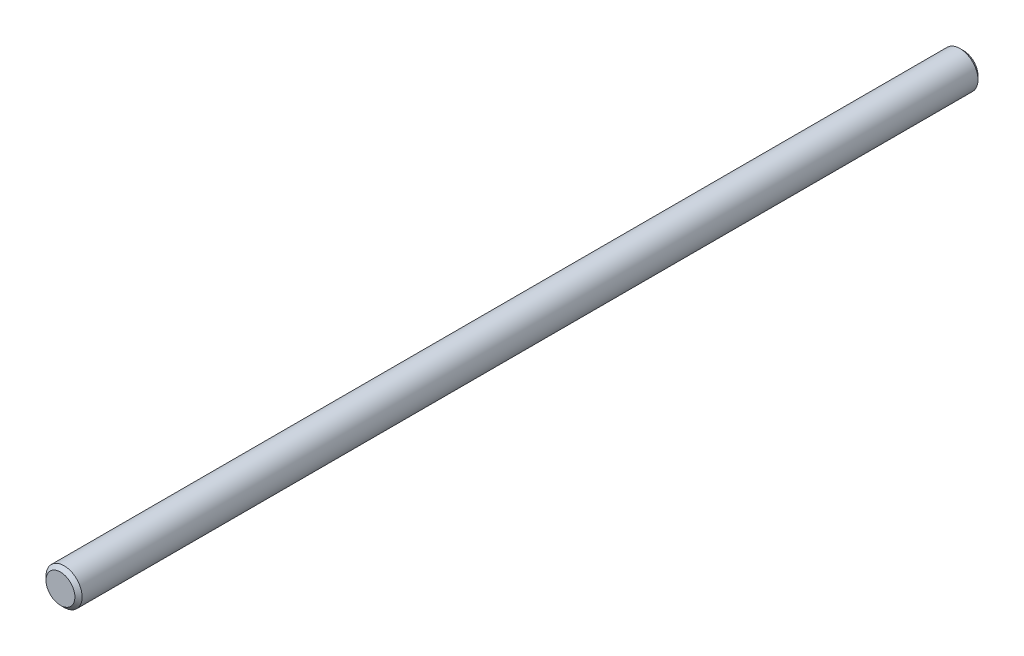
ISO-10303-21;
HEADER;
FILE_DESCRIPTION(('STEP AP214'),'2;1');
FILE_NAME('part.step','',(''),(''),'','','');
FILE_SCHEMA(('AUTOMOTIVE_DESIGN { 1 0 10303 214 1 1 1 1 }'));
ENDSEC;
DATA;
#1=APPLICATION_CONTEXT('core data for automotive mechanical design processes');
#2=APPLICATION_PROTOCOL_DEFINITION('international standard','automotive_design',2000,#1);
#3=PRODUCT_CONTEXT('',#1,'mechanical');
#4=PRODUCT('Part','Part','',(#3));
#5=PRODUCT_RELATED_PRODUCT_CATEGORY('part','',(#4));
#6=PRODUCT_DEFINITION_FORMATION('','',#4);
#7=PRODUCT_DEFINITION_CONTEXT('part definition',#1,'design');
#8=PRODUCT_DEFINITION('design','',#6,#7);
#9=PRODUCT_DEFINITION_SHAPE('','',#8);
#10=(LENGTH_UNIT() NAMED_UNIT(*) SI_UNIT(.MILLI.,.METRE.));
#11=(NAMED_UNIT(*) PLANE_ANGLE_UNIT() SI_UNIT($,.RADIAN.));
#12=(NAMED_UNIT(*) SI_UNIT($,.STERADIAN.) SOLID_ANGLE_UNIT());
#13=UNCERTAINTY_MEASURE_WITH_UNIT(LENGTH_MEASURE(1.E-05),#10,'distance_accuracy_value','');
#14=(GEOMETRIC_REPRESENTATION_CONTEXT(3) GLOBAL_UNCERTAINTY_ASSIGNED_CONTEXT((#13)) GLOBAL_UNIT_ASSIGNED_CONTEXT((#10,
#11,#12)) REPRESENTATION_CONTEXT('',''));
#15=CARTESIAN_POINT('',(0.,0.,0.));
#16=DIRECTION('',(0.,0.,1.));
#17=DIRECTION('',(1.,0.,0.));
#18=AXIS2_PLACEMENT_3D('',#15,#16,#17);
#19=CARTESIAN_POINT('',(0.,0.,100.));
#20=DIRECTION('',(0.,0.,-1.));
#21=DIRECTION('',(-1.,0.,0.));
#22=AXIS2_PLACEMENT_3D('',#19,#20,#21);
#23=CYLINDRICAL_SURFACE('',#22,4.);
#24=CARTESIAN_POINT('',(0.,0.,-99.1999999999999));
#25=DIRECTION('',(0.,0.,1.));
#26=DIRECTION('',(1.,0.,0.));
#27=AXIS2_PLACEMENT_3D('',#24,#25,#26);
#28=CIRCLE('',#27,4.);
#29=CARTESIAN_POINT('',(4.,0.,-99.1999999999999));
#30=VERTEX_POINT('',#29);
#31=EDGE_CURVE('E41',#30,#30,#28,.T.);
#32=ORIENTED_EDGE('',*,*,#31,.T.);
#33=EDGE_LOOP('',(#32));
#34=FACE_BOUND('',#33,.T.);
#35=CARTESIAN_POINT('',(0.,0.,99.2));
#36=DIRECTION('',(0.,0.,1.));
#37=DIRECTION('',(1.,0.,0.));
#38=AXIS2_PLACEMENT_3D('',#35,#36,#37);
#39=CIRCLE('',#38,4.);
#40=CARTESIAN_POINT('',(4.,0.,99.2));
#41=VERTEX_POINT('',#40);
#42=EDGE_CURVE('E45',#41,#41,#39,.F.);
#43=ORIENTED_EDGE('',*,*,#42,.T.);
#44=EDGE_LOOP('',(#43));
#45=FACE_BOUND('',#44,.T.);
#46=ADVANCED_FACE('F30',(#34,#45),#23,.T.);
#47=CARTESIAN_POINT('',(0.,0.,100.));
#48=DIRECTION('',(0.,0.,1.));
#49=DIRECTION('',(1.,0.,0.));
#50=AXIS2_PLACEMENT_3D('',#47,#48,#49);
#51=PLANE('',#50);
#52=CARTESIAN_POINT('',(0.,0.,100.));
#53=DIRECTION('',(0.,0.,1.));
#54=DIRECTION('',(1.,0.,0.));
#55=AXIS2_PLACEMENT_3D('',#52,#53,#54);
#56=CIRCLE('',#55,3.20000000000001);
#57=CARTESIAN_POINT('',(3.20000000000001,0.,100.));
#58=VERTEX_POINT('',#57);
#59=EDGE_CURVE('E10',#58,#58,#56,.T.);
#60=ORIENTED_EDGE('',*,*,#59,.T.);
#61=EDGE_LOOP('',(#60));
#62=FACE_BOUND('',#61,.T.);
#63=ADVANCED_FACE('F61',(#62),#51,.T.);
#64=CARTESIAN_POINT('',(0.,0.,-100.));
#65=DIRECTION('',(0.,0.,1.));
#66=DIRECTION('',(1.,0.,0.));
#67=AXIS2_PLACEMENT_3D('',#64,#65,#66);
#68=PLANE('',#67);
#69=CARTESIAN_POINT('',(0.,0.,-100.));
#70=DIRECTION('',(0.,0.,1.));
#71=DIRECTION('',(1.,0.,0.));
#72=AXIS2_PLACEMENT_3D('',#69,#70,#71);
#73=CIRCLE('',#72,3.19999999999998);
#74=CARTESIAN_POINT('',(3.19999999999998,0.,-100.));
#75=VERTEX_POINT('',#74);
#76=EDGE_CURVE('E37',#75,#75,#73,.F.);
#77=ORIENTED_EDGE('',*,*,#76,.T.);
#78=EDGE_LOOP('',(#77));
#79=FACE_BOUND('',#78,.T.);
#80=ADVANCED_FACE('F58',(#79),#68,.F.);
#81=CARTESIAN_POINT('',(0.,0.,-99.1999999999999));
#82=DIRECTION('',(0.,0.,1.));
#83=DIRECTION('',(1.,0.,0.));
#84=AXIS2_PLACEMENT_3D('',#81,#82,#83);
#85=CONICAL_SURFACE('',#84,4.,0.785398163397412);
#86=ORIENTED_EDGE('',*,*,#76,.F.);
#87=EDGE_LOOP('',(#86));
#88=FACE_BOUND('',#87,.T.);
#89=ORIENTED_EDGE('',*,*,#31,.F.);
#90=EDGE_LOOP('',(#89));
#91=FACE_BOUND('',#90,.T.);
#92=ADVANCED_FACE('F54',(#88,#91),#85,.T.);
#93=CARTESIAN_POINT('',(0.,0.,100.));
#94=DIRECTION('',(0.,0.,-1.));
#95=DIRECTION('',(-1.,0.,0.));
#96=AXIS2_PLACEMENT_3D('',#93,#94,#95);
#97=CONICAL_SURFACE('',#96,3.20000000000001,0.785398163397438);
#98=ORIENTED_EDGE('',*,*,#42,.F.);
#99=EDGE_LOOP('',(#98));
#100=FACE_BOUND('',#99,.T.);
#101=ORIENTED_EDGE('',*,*,#59,.F.);
#102=EDGE_LOOP('',(#101));
#103=FACE_BOUND('',#102,.T.);
#104=ADVANCED_FACE('F32',(#100,#103),#97,.T.);
#105=CLOSED_SHELL('',(#46,#63,#80,#92,#104));
#106=MANIFOLD_SOLID_BREP('B2',#105);
#107=ADVANCED_BREP_SHAPE_REPRESENTATION('',(#18,#106),#14);
#108=SHAPE_DEFINITION_REPRESENTATION(#9,#107);
ENDSEC;
END-ISO-10303-21;
